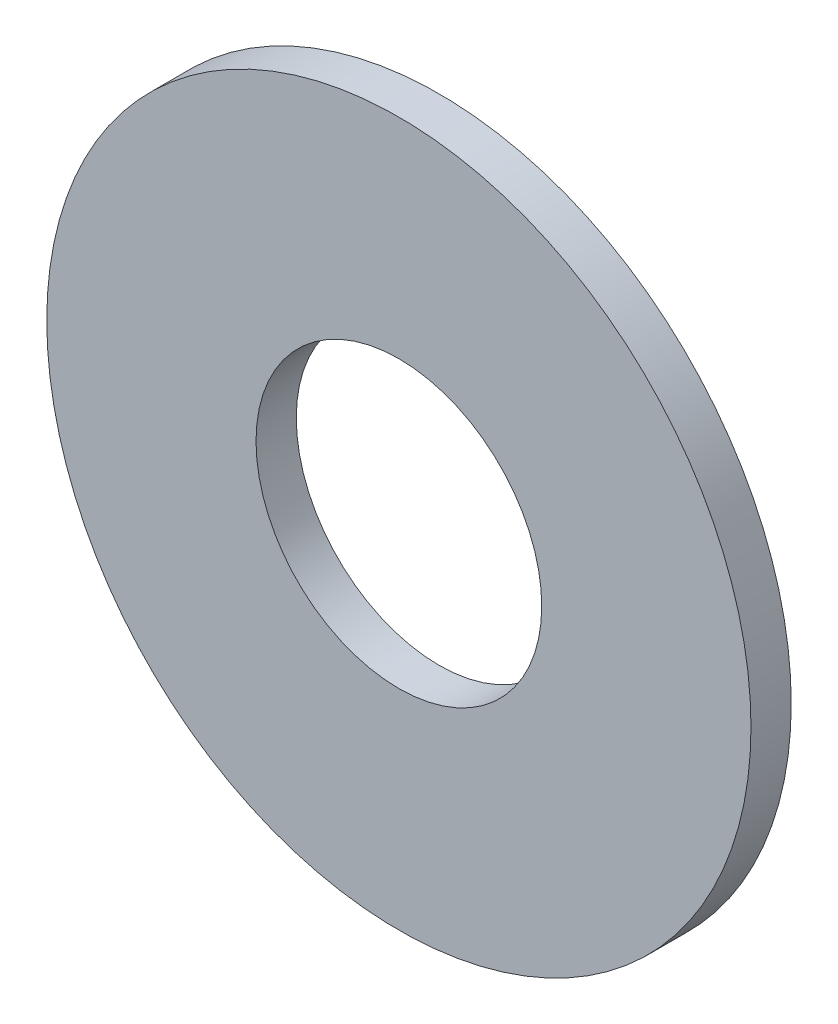
ISO-10303-21;
HEADER;
FILE_DESCRIPTION(('STEP AP214'),'2;1');
FILE_NAME('part.step','',(''),(''),'','','');
FILE_SCHEMA(('AUTOMOTIVE_DESIGN { 1 0 10303 214 1 1 1 1 }'));
ENDSEC;
DATA;
#1=APPLICATION_CONTEXT('core data for automotive mechanical design processes');
#2=APPLICATION_PROTOCOL_DEFINITION('international standard','automotive_design',2000,#1);
#3=PRODUCT_CONTEXT('',#1,'mechanical');
#4=PRODUCT('Part','Part','',(#3));
#5=PRODUCT_RELATED_PRODUCT_CATEGORY('part','',(#4));
#6=PRODUCT_DEFINITION_FORMATION('','',#4);
#7=PRODUCT_DEFINITION_CONTEXT('part definition',#1,'design');
#8=PRODUCT_DEFINITION('design','',#6,#7);
#9=PRODUCT_DEFINITION_SHAPE('','',#8);
#10=(LENGTH_UNIT() NAMED_UNIT(*) SI_UNIT(.MILLI.,.METRE.));
#11=(NAMED_UNIT(*) PLANE_ANGLE_UNIT() SI_UNIT($,.RADIAN.));
#12=(NAMED_UNIT(*) SI_UNIT($,.STERADIAN.) SOLID_ANGLE_UNIT());
#13=UNCERTAINTY_MEASURE_WITH_UNIT(LENGTH_MEASURE(1.E-05),#10,'distance_accuracy_value','');
#14=(GEOMETRIC_REPRESENTATION_CONTEXT(3) GLOBAL_UNCERTAINTY_ASSIGNED_CONTEXT((#13)) GLOBAL_UNIT_ASSIGNED_CONTEXT((#10,
#11,#12)) REPRESENTATION_CONTEXT('',''));
#15=CARTESIAN_POINT('',(0.,0.,0.));
#16=DIRECTION('',(0.,0.,1.));
#17=DIRECTION('',(1.,0.,0.));
#18=AXIS2_PLACEMENT_3D('',#15,#16,#17);
#19=CARTESIAN_POINT('',(0.,0.,2.));
#20=DIRECTION('',(0.,0.,1.));
#21=DIRECTION('',(1.,0.,0.));
#22=AXIS2_PLACEMENT_3D('',#19,#20,#21);
#23=PLANE('',#22);
#24=CARTESIAN_POINT('',(0.,0.,2.));
#25=DIRECTION('',(0.,0.,1.));
#26=DIRECTION('',(1.,0.,0.));
#27=AXIS2_PLACEMENT_3D('',#24,#25,#26);
#28=CIRCLE('',#27,17.5);
#29=CARTESIAN_POINT('',(17.5,0.,2.));
#30=VERTEX_POINT('',#29);
#31=EDGE_CURVE('E10',#30,#30,#28,.T.);
#32=ORIENTED_EDGE('',*,*,#31,.T.);
#33=EDGE_LOOP('',(#32));
#34=FACE_BOUND('',#33,.T.);
#35=CARTESIAN_POINT('',(0.,0.,2.));
#36=DIRECTION('',(0.,0.,1.));
#37=DIRECTION('',(1.,0.,0.));
#38=AXIS2_PLACEMENT_3D('',#35,#36,#37);
#39=CIRCLE('',#38,7.1);
#40=CARTESIAN_POINT('',(7.1,0.,2.));
#41=VERTEX_POINT('',#40);
#42=EDGE_CURVE('E359',#41,#41,#39,.T.);
#43=ORIENTED_EDGE('',*,*,#42,.F.);
#44=EDGE_LOOP('',(#43));
#45=FACE_BOUND('',#44,.T.);
#46=ADVANCED_FACE('F348',(#34,#45),#23,.T.);
#47=CARTESIAN_POINT('',(0.,0.,0.));
#48=DIRECTION('',(0.,0.,1.));
#49=DIRECTION('',(1.,0.,0.));
#50=AXIS2_PLACEMENT_3D('',#47,#48,#49);
#51=PLANE('',#50);
#52=CARTESIAN_POINT('',(0.,0.,0.));
#53=DIRECTION('',(0.,0.,1.));
#54=DIRECTION('',(1.,0.,0.));
#55=AXIS2_PLACEMENT_3D('',#52,#53,#54);
#56=CIRCLE('',#55,17.5);
#57=CARTESIAN_POINT('',(17.5,0.,0.));
#58=VERTEX_POINT('',#57);
#59=EDGE_CURVE('E355',#58,#58,#56,.T.);
#60=ORIENTED_EDGE('',*,*,#59,.F.);
#61=EDGE_LOOP('',(#60));
#62=FACE_BOUND('',#61,.T.);
#63=CARTESIAN_POINT('',(0.,0.,0.));
#64=DIRECTION('',(0.,0.,1.));
#65=DIRECTION('',(1.,0.,0.));
#66=AXIS2_PLACEMENT_3D('',#63,#64,#65);
#67=CIRCLE('',#66,7.1);
#68=CARTESIAN_POINT('',(7.1,0.,0.));
#69=VERTEX_POINT('',#68);
#70=EDGE_CURVE('E363',#69,#69,#67,.T.);
#71=ORIENTED_EDGE('',*,*,#70,.T.);
#72=EDGE_LOOP('',(#71));
#73=FACE_BOUND('',#72,.T.);
#74=ADVANCED_FACE('F369',(#62,#73),#51,.F.);
#75=CARTESIAN_POINT('',(0.,0.,2.));
#76=DIRECTION('',(0.,0.,-1.));
#77=DIRECTION('',(-1.,0.,0.));
#78=AXIS2_PLACEMENT_3D('',#75,#76,#77);
#79=CYLINDRICAL_SURFACE('',#78,17.5);
#80=ORIENTED_EDGE('',*,*,#31,.F.);
#81=EDGE_LOOP('',(#80));
#82=FACE_BOUND('',#81,.T.);
#83=ORIENTED_EDGE('',*,*,#59,.T.);
#84=EDGE_LOOP('',(#83));
#85=FACE_BOUND('',#84,.T.);
#86=ADVANCED_FACE('F350',(#82,#85),#79,.T.);
#87=CARTESIAN_POINT('',(0.,0.,2.));
#88=DIRECTION('',(0.,0.,-1.));
#89=DIRECTION('',(-1.,0.,0.));
#90=AXIS2_PLACEMENT_3D('',#87,#88,#89);
#91=CYLINDRICAL_SURFACE('',#90,7.1);
#92=ORIENTED_EDGE('',*,*,#42,.T.);
#93=EDGE_LOOP('',(#92));
#94=FACE_BOUND('',#93,.T.);
#95=ORIENTED_EDGE('',*,*,#70,.F.);
#96=EDGE_LOOP('',(#95));
#97=FACE_BOUND('',#96,.T.);
#98=ADVANCED_FACE('F371',(#94,#97),#91,.F.);
#99=CLOSED_SHELL('',(#46,#74,#86,#98));
#100=MANIFOLD_SOLID_BREP('B2',#99);
#101=ADVANCED_BREP_SHAPE_REPRESENTATION('',(#18,#100),#14);
#102=SHAPE_DEFINITION_REPRESENTATION(#9,#101);
ENDSEC;
END-ISO-10303-21;
